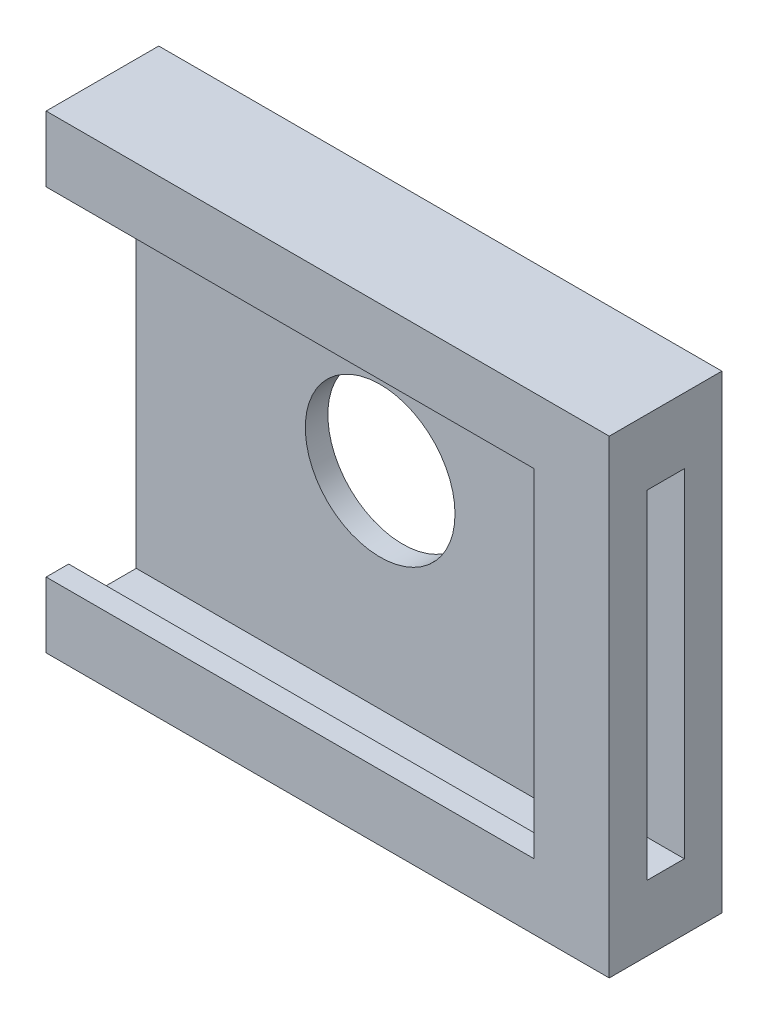
ISO-10303-21;
HEADER;
FILE_DESCRIPTION(('STEP AP214'),'2;1');
FILE_NAME('part.step','',(''),(''),'','','');
FILE_SCHEMA(('AUTOMOTIVE_DESIGN { 1 0 10303 214 1 1 1 1 }'));
ENDSEC;
DATA;
#1=APPLICATION_CONTEXT('core data for automotive mechanical design processes');
#2=APPLICATION_PROTOCOL_DEFINITION('international standard','automotive_design',2000,#1);
#3=PRODUCT_CONTEXT('',#1,'mechanical');
#4=PRODUCT('Part','Part','',(#3));
#5=PRODUCT_RELATED_PRODUCT_CATEGORY('part','',(#4));
#6=PRODUCT_DEFINITION_FORMATION('','',#4);
#7=PRODUCT_DEFINITION_CONTEXT('part definition',#1,'design');
#8=PRODUCT_DEFINITION('design','',#6,#7);
#9=PRODUCT_DEFINITION_SHAPE('','',#8);
#10=(LENGTH_UNIT() NAMED_UNIT(*) SI_UNIT(.MILLI.,.METRE.));
#11=(NAMED_UNIT(*) PLANE_ANGLE_UNIT() SI_UNIT($,.RADIAN.));
#12=(NAMED_UNIT(*) SI_UNIT($,.STERADIAN.) SOLID_ANGLE_UNIT());
#13=UNCERTAINTY_MEASURE_WITH_UNIT(LENGTH_MEASURE(1.E-05),#10,'distance_accuracy_value','');
#14=(GEOMETRIC_REPRESENTATION_CONTEXT(3) GLOBAL_UNCERTAINTY_ASSIGNED_CONTEXT((#13)) GLOBAL_UNIT_ASSIGNED_CONTEXT((#10,
#11,#12)) REPRESENTATION_CONTEXT('',''));
#15=CARTESIAN_POINT('',(0.,0.,0.));
#16=DIRECTION('',(0.,0.,1.));
#17=DIRECTION('',(1.,0.,0.));
#18=AXIS2_PLACEMENT_3D('',#15,#16,#17);
#19=CARTESIAN_POINT('',(0.,0.,3.));
#20=DIRECTION('',(-1.,0.,0.));
#21=DIRECTION('',(0.,0.,1.));
#22=AXIS2_PLACEMENT_3D('',#19,#20,#21);
#23=PLANE('',#22);
#24=DIRECTION('',(0.,0.,-1.));
#25=VECTOR('',#24,1.);
#26=CARTESIAN_POINT('',(0.,10.75,1.));
#27=LINE('',#26,#25);
#28=CARTESIAN_POINT('',(0.,10.75,2.));
#29=VERTEX_POINT('',#28);
#30=CARTESIAN_POINT('',(0.,10.75,1.));
#31=VERTEX_POINT('',#30);
#32=EDGE_CURVE('E169',#29,#31,#27,.T.);
#33=ORIENTED_EDGE('',*,*,#32,.T.);
#34=DIRECTION('',(0.,-1.,0.));
#35=VECTOR('',#34,1.);
#36=CARTESIAN_POINT('',(0.,10.75,1.));
#37=LINE('',#36,#35);
#38=CARTESIAN_POINT('',(0.,1.75,1.));
#39=VERTEX_POINT('',#38);
#40=EDGE_CURVE('E162',#31,#39,#37,.T.);
#41=ORIENTED_EDGE('',*,*,#40,.T.);
#42=DIRECTION('',(0.,0.,1.));
#43=VECTOR('',#42,1.);
#44=CARTESIAN_POINT('',(0.,1.75,1.));
#45=LINE('',#44,#43);
#46=CARTESIAN_POINT('',(0.,1.75,2.));
#47=VERTEX_POINT('',#46);
#48=EDGE_CURVE('E172',#39,#47,#45,.T.);
#49=ORIENTED_EDGE('',*,*,#48,.T.);
#50=DIRECTION('',(0.,1.,0.));
#51=VECTOR('',#50,1.);
#52=CARTESIAN_POINT('',(0.,10.75,2.));
#53=LINE('',#52,#51);
#54=EDGE_CURVE('E62',#47,#29,#53,.T.);
#55=ORIENTED_EDGE('',*,*,#54,.T.);
#56=EDGE_LOOP('',(#33,#41,#49,#55));
#57=FACE_BOUND('',#56,.T.);
#58=DIRECTION('',(0.,1.,0.));
#59=VECTOR('',#58,1.);
#60=CARTESIAN_POINT('',(0.,0.,0.));
#61=LINE('',#60,#59);
#62=CARTESIAN_POINT('',(0.,0.,0.));
#63=VERTEX_POINT('',#62);
#64=CARTESIAN_POINT('',(0.,12.5,0.));
#65=VERTEX_POINT('',#64);
#66=EDGE_CURVE('E288',#63,#65,#61,.T.);
#67=ORIENTED_EDGE('',*,*,#66,.T.);
#68=DIRECTION('',(0.,0.,-1.));
#69=VECTOR('',#68,1.);
#70=CARTESIAN_POINT('',(0.,12.5,3.));
#71=LINE('',#70,#69);
#72=CARTESIAN_POINT('',(0.,12.5,3.));
#73=VERTEX_POINT('',#72);
#74=EDGE_CURVE('E12',#73,#65,#71,.T.);
#75=ORIENTED_EDGE('',*,*,#74,.F.);
#76=DIRECTION('',(0.,1.,0.));
#77=VECTOR('',#76,1.);
#78=CARTESIAN_POINT('',(0.,0.,3.));
#79=LINE('',#78,#77);
#80=CARTESIAN_POINT('',(0.,0.,3.));
#81=VERTEX_POINT('',#80);
#82=EDGE_CURVE('E289',#81,#73,#79,.T.);
#83=ORIENTED_EDGE('',*,*,#82,.F.);
#84=DIRECTION('',(0.,0.,-1.));
#85=VECTOR('',#84,1.);
#86=CARTESIAN_POINT('',(0.,0.,3.));
#87=LINE('',#86,#85);
#88=EDGE_CURVE('E305',#81,#63,#87,.T.);
#89=ORIENTED_EDGE('',*,*,#88,.T.);
#90=EDGE_LOOP('',(#67,#75,#83,#89));
#91=FACE_BOUND('',#90,.T.);
#92=ADVANCED_FACE('F47',(#57,#91),#23,.F.);
#93=CARTESIAN_POINT('',(0.,12.5,3.));
#94=DIRECTION('',(0.,-1.,0.));
#95=DIRECTION('',(1.,0.,0.));
#96=AXIS2_PLACEMENT_3D('',#93,#94,#95);
#97=PLANE('',#96);
#98=DIRECTION('',(-1.,0.,0.));
#99=VECTOR('',#98,1.);
#100=CARTESIAN_POINT('',(0.,12.5,0.));
#101=LINE('',#100,#99);
#102=CARTESIAN_POINT('',(-15.,12.5,0.));
#103=VERTEX_POINT('',#102);
#104=EDGE_CURVE('E309',#65,#103,#101,.T.);
#105=ORIENTED_EDGE('',*,*,#104,.T.);
#106=DIRECTION('',(0.,0.,-1.));
#107=VECTOR('',#106,1.);
#108=CARTESIAN_POINT('',(-15.,12.5,3.));
#109=LINE('',#108,#107);
#110=CARTESIAN_POINT('',(-15.,12.5,3.));
#111=VERTEX_POINT('',#110);
#112=EDGE_CURVE('E55',#111,#103,#109,.T.);
#113=ORIENTED_EDGE('',*,*,#112,.F.);
#114=DIRECTION('',(-1.,0.,0.));
#115=VECTOR('',#114,1.);
#116=CARTESIAN_POINT('',(0.,12.5,3.));
#117=LINE('',#116,#115);
#118=EDGE_CURVE('E293',#73,#111,#117,.T.);
#119=ORIENTED_EDGE('',*,*,#118,.F.);
#120=ORIENTED_EDGE('',*,*,#74,.T.);
#121=EDGE_LOOP('',(#105,#113,#119,#120));
#122=FACE_BOUND('',#121,.T.);
#123=ADVANCED_FACE('F396',(#122),#97,.F.);
#124=CARTESIAN_POINT('',(-15.,0.,3.));
#125=DIRECTION('',(1.,0.,0.));
#126=DIRECTION('',(0.,0.,-1.));
#127=AXIS2_PLACEMENT_3D('',#124,#125,#126);
#128=PLANE('',#127);
#129=DIRECTION('',(0.,1.,0.));
#130=VECTOR('',#129,1.);
#131=CARTESIAN_POINT('',(-15.,11.75,2.4));
#132=LINE('',#131,#130);
#133=CARTESIAN_POINT('',(-15.,10.75,2.4));
#134=VERTEX_POINT('',#133);
#135=CARTESIAN_POINT('',(-15.,11.75,2.4));
#136=VERTEX_POINT('',#135);
#137=EDGE_CURVE('E254',#134,#136,#132,.T.);
#138=ORIENTED_EDGE('',*,*,#137,.F.);
#139=DIRECTION('',(0.,0.,-1.));
#140=VECTOR('',#139,1.);
#141=CARTESIAN_POINT('',(-15.,10.75,2.4));
#142=LINE('',#141,#140);
#143=CARTESIAN_POINT('',(-15.,10.75,3.));
#144=VERTEX_POINT('',#143);
#145=EDGE_CURVE('E250',#144,#134,#142,.T.);
#146=ORIENTED_EDGE('',*,*,#145,.F.);
#147=DIRECTION('',(0.,-1.,0.));
#148=VECTOR('',#147,1.);
#149=CARTESIAN_POINT('',(-15.,0.,3.));
#150=LINE('',#149,#148);
#151=EDGE_CURVE('E298',#111,#144,#150,.T.);
#152=ORIENTED_EDGE('',*,*,#151,.F.);
#153=ORIENTED_EDGE('',*,*,#112,.T.);
#154=DIRECTION('',(0.,-1.,0.));
#155=VECTOR('',#154,1.);
#156=CARTESIAN_POINT('',(-15.,0.,0.));
#157=LINE('',#156,#155);
#158=CARTESIAN_POINT('',(-15.,0.,0.));
#159=VERTEX_POINT('',#158);
#160=EDGE_CURVE('E312',#103,#159,#157,.T.);
#161=ORIENTED_EDGE('',*,*,#160,.T.);
#162=DIRECTION('',(0.,0.,-1.));
#163=VECTOR('',#162,1.);
#164=CARTESIAN_POINT('',(-15.,0.,3.));
#165=LINE('',#164,#163);
#166=CARTESIAN_POINT('',(-15.,0.,3.));
#167=VERTEX_POINT('',#166);
#168=EDGE_CURVE('E320',#167,#159,#165,.T.);
#169=ORIENTED_EDGE('',*,*,#168,.F.);
#170=CARTESIAN_POINT('',(-15.,1.75,3.));
#171=VERTEX_POINT('',#170);
#172=EDGE_CURVE('E297',#171,#167,#150,.T.);
#173=ORIENTED_EDGE('',*,*,#172,.F.);
#174=DIRECTION('',(0.,0.,1.));
#175=VECTOR('',#174,1.);
#176=CARTESIAN_POINT('',(-15.,1.75,2.4));
#177=LINE('',#176,#175);
#178=CARTESIAN_POINT('',(-15.,1.75,2.4));
#179=VERTEX_POINT('',#178);
#180=EDGE_CURVE('E247',#179,#171,#177,.T.);
#181=ORIENTED_EDGE('',*,*,#180,.F.);
#182=DIRECTION('',(0.,1.,0.));
#183=VECTOR('',#182,1.);
#184=CARTESIAN_POINT('',(-15.,1.75,2.4));
#185=LINE('',#184,#183);
#186=CARTESIAN_POINT('',(-15.,0.749999999999999,2.4));
#187=VERTEX_POINT('',#186);
#188=EDGE_CURVE('E243',#187,#179,#185,.T.);
#189=ORIENTED_EDGE('',*,*,#188,.F.);
#190=DIRECTION('',(0.,0.,1.));
#191=VECTOR('',#190,1.);
#192=CARTESIAN_POINT('',(-15.,0.749999999999999,0.6));
#193=LINE('',#192,#191);
#194=CARTESIAN_POINT('',(-15.,0.749999999999999,0.6));
#195=VERTEX_POINT('',#194);
#196=EDGE_CURVE('E239',#195,#187,#193,.T.);
#197=ORIENTED_EDGE('',*,*,#196,.F.);
#198=DIRECTION('',(0.,-1.,0.));
#199=VECTOR('',#198,1.);
#200=CARTESIAN_POINT('',(-15.,11.75,0.6));
#201=LINE('',#200,#199);
#202=CARTESIAN_POINT('',(-15.,11.75,0.6));
#203=VERTEX_POINT('',#202);
#204=EDGE_CURVE('E206',#203,#195,#201,.T.);
#205=ORIENTED_EDGE('',*,*,#204,.F.);
#206=DIRECTION('',(0.,0.,-1.));
#207=VECTOR('',#206,1.);
#208=CARTESIAN_POINT('',(-15.,11.75,0.6));
#209=LINE('',#208,#207);
#210=EDGE_CURVE('E258',#136,#203,#209,.T.);
#211=ORIENTED_EDGE('',*,*,#210,.F.);
#212=EDGE_LOOP('',(#138,#146,#152,#153,#161,#169,#173,#181,#189,#197,#205,#211));
#213=FACE_BOUND('',#212,.T.);
#214=ADVANCED_FACE('F330',(#213),#128,.F.);
#215=CARTESIAN_POINT('',(0.,0.,3.));
#216=DIRECTION('',(0.,1.,0.));
#217=DIRECTION('',(-1.,0.,0.));
#218=AXIS2_PLACEMENT_3D('',#215,#216,#217);
#219=PLANE('',#218);
#220=DIRECTION('',(1.,0.,0.));
#221=VECTOR('',#220,1.);
#222=CARTESIAN_POINT('',(0.,0.,0.));
#223=LINE('',#222,#221);
#224=EDGE_CURVE('E294',#159,#63,#223,.T.);
#225=ORIENTED_EDGE('',*,*,#224,.T.);
#226=ORIENTED_EDGE('',*,*,#88,.F.);
#227=DIRECTION('',(1.,0.,0.));
#228=VECTOR('',#227,1.);
#229=CARTESIAN_POINT('',(0.,0.,3.));
#230=LINE('',#229,#228);
#231=EDGE_CURVE('E302',#167,#81,#230,.T.);
#232=ORIENTED_EDGE('',*,*,#231,.F.);
#233=ORIENTED_EDGE('',*,*,#168,.T.);
#234=EDGE_LOOP('',(#225,#226,#232,#233));
#235=FACE_BOUND('',#234,.T.);
#236=ADVANCED_FACE('F340',(#235),#219,.F.);
#237=CARTESIAN_POINT('',(0.,0.,3.));
#238=DIRECTION('',(0.,0.,1.));
#239=DIRECTION('',(1.,0.,0.));
#240=AXIS2_PLACEMENT_3D('',#237,#238,#239);
#241=PLANE('',#240);
#242=DIRECTION('',(-1.,0.,0.));
#243=VECTOR('',#242,1.);
#244=CARTESIAN_POINT('',(11.2587743560301,10.75,3.));
#245=LINE('',#244,#243);
#246=CARTESIAN_POINT('',(-2.,10.75,3.));
#247=VERTEX_POINT('',#246);
#248=EDGE_CURVE('E271',#247,#144,#245,.T.);
#249=ORIENTED_EDGE('',*,*,#248,.F.);
#250=DIRECTION('',(0.,-1.,0.));
#251=VECTOR('',#250,1.);
#252=CARTESIAN_POINT('',(-2.,1.75,3.));
#253=LINE('',#252,#251);
#254=CARTESIAN_POINT('',(-2.,1.75,3.));
#255=VERTEX_POINT('',#254);
#256=EDGE_CURVE('E219',#247,#255,#253,.T.);
#257=ORIENTED_EDGE('',*,*,#256,.T.);
#258=DIRECTION('',(-1.,0.,0.));
#259=VECTOR('',#258,1.);
#260=CARTESIAN_POINT('',(11.2587743560301,1.75,3.));
#261=LINE('',#260,#259);
#262=EDGE_CURVE('E274',#255,#171,#261,.T.);
#263=ORIENTED_EDGE('',*,*,#262,.T.);
#264=ORIENTED_EDGE('',*,*,#172,.T.);
#265=ORIENTED_EDGE('',*,*,#231,.T.);
#266=ORIENTED_EDGE('',*,*,#82,.T.);
#267=ORIENTED_EDGE('',*,*,#118,.T.);
#268=ORIENTED_EDGE('',*,*,#151,.T.);
#269=EDGE_LOOP('',(#249,#257,#263,#264,#265,#266,#267,#268));
#270=FACE_BOUND('',#269,.T.);
#271=ADVANCED_FACE('F346',(#270),#241,.T.);
#272=CARTESIAN_POINT('',(0.,0.,0.));
#273=DIRECTION('',(0.,0.,1.));
#274=DIRECTION('',(1.,0.,0.));
#275=AXIS2_PLACEMENT_3D('',#272,#273,#274);
#276=PLANE('',#275);
#277=CARTESIAN_POINT('',(-8.50240000000002,6.24999999999998,0.));
#278=DIRECTION('',(0.,0.,1.));
#279=DIRECTION('',(1.,0.,0.));
#280=AXIS2_PLACEMENT_3D('',#277,#278,#279);
#281=CIRCLE('',#280,1.99389999999999);
#282=CARTESIAN_POINT('',(-6.50850000000003,6.24999999999998,0.));
#283=VERTEX_POINT('',#282);
#284=EDGE_CURVE('E197',#283,#283,#281,.T.);
#285=ORIENTED_EDGE('',*,*,#284,.T.);
#286=EDGE_LOOP('',(#285));
#287=FACE_BOUND('',#286,.T.);
#288=ORIENTED_EDGE('',*,*,#66,.F.);
#289=ORIENTED_EDGE('',*,*,#224,.F.);
#290=ORIENTED_EDGE('',*,*,#160,.F.);
#291=ORIENTED_EDGE('',*,*,#104,.F.);
#292=EDGE_LOOP('',(#288,#289,#290,#291));
#293=FACE_BOUND('',#292,.T.);
#294=ADVANCED_FACE('F337',(#287,#293),#276,.F.);
#295=CARTESIAN_POINT('',(11.2587743560301,11.75,0.6));
#296=DIRECTION('',(0.,0.,-1.));
#297=DIRECTION('',(-1.,0.,0.));
#298=AXIS2_PLACEMENT_3D('',#295,#296,#297);
#299=PLANE('',#298);
#300=CARTESIAN_POINT('',(-8.50240000000002,6.24999999999998,0.599999999999934));
#301=DIRECTION('',(0.,0.,1.));
#302=DIRECTION('',(1.,0.,0.));
#303=AXIS2_PLACEMENT_3D('',#300,#301,#302);
#304=CIRCLE('',#303,1.99389999999999);
#305=CARTESIAN_POINT('',(-6.50850000000003,6.24999999999998,0.599999999999934));
#306=VERTEX_POINT('',#305);
#307=EDGE_CURVE('E187',#306,#306,#304,.T.);
#308=ORIENTED_EDGE('',*,*,#307,.F.);
#309=EDGE_LOOP('',(#308));
#310=FACE_BOUND('',#309,.T.);
#311=DIRECTION('',(0.,1.,0.));
#312=VECTOR('',#311,1.);
#313=CARTESIAN_POINT('',(-2.,11.75,0.6));
#314=LINE('',#313,#312);
#315=CARTESIAN_POINT('',(-2.,0.749999999999999,0.6));
#316=VERTEX_POINT('',#315);
#317=CARTESIAN_POINT('',(-2.,11.75,0.6));
#318=VERTEX_POINT('',#317);
#319=EDGE_CURVE('E232',#316,#318,#314,.T.);
#320=ORIENTED_EDGE('',*,*,#319,.T.);
#321=DIRECTION('',(-1.,0.,0.));
#322=VECTOR('',#321,1.);
#323=CARTESIAN_POINT('',(11.2587743560301,11.75,0.6));
#324=LINE('',#323,#322);
#325=EDGE_CURVE('E216',#318,#203,#324,.T.);
#326=ORIENTED_EDGE('',*,*,#325,.T.);
#327=ORIENTED_EDGE('',*,*,#204,.T.);
#328=DIRECTION('',(-1.,0.,0.));
#329=VECTOR('',#328,1.);
#330=CARTESIAN_POINT('',(11.2587743560301,0.749999999999999,0.6));
#331=LINE('',#330,#329);
#332=EDGE_CURVE('E262',#316,#195,#331,.T.);
#333=ORIENTED_EDGE('',*,*,#332,.F.);
#334=EDGE_LOOP('',(#320,#326,#327,#333));
#335=FACE_BOUND('',#334,.T.);
#336=ADVANCED_FACE('F367',(#310,#335),#299,.F.);
#337=CARTESIAN_POINT('',(11.2587743560301,11.75,0.6));
#338=DIRECTION('',(0.,1.,0.));
#339=DIRECTION('',(0.,0.,1.));
#340=AXIS2_PLACEMENT_3D('',#337,#338,#339);
#341=PLANE('',#340);
#342=DIRECTION('',(0.,0.,1.));
#343=VECTOR('',#342,1.);
#344=CARTESIAN_POINT('',(-2.,11.75,0.6));
#345=LINE('',#344,#343);
#346=CARTESIAN_POINT('',(-2.,11.75,2.4));
#347=VERTEX_POINT('',#346);
#348=EDGE_CURVE('E229',#318,#347,#345,.T.);
#349=ORIENTED_EDGE('',*,*,#348,.T.);
#350=DIRECTION('',(-1.,0.,0.));
#351=VECTOR('',#350,1.);
#352=CARTESIAN_POINT('',(11.2587743560301,11.75,2.4));
#353=LINE('',#352,#351);
#354=EDGE_CURVE('E265',#347,#136,#353,.T.);
#355=ORIENTED_EDGE('',*,*,#354,.T.);
#356=ORIENTED_EDGE('',*,*,#210,.T.);
#357=ORIENTED_EDGE('',*,*,#325,.F.);
#358=EDGE_LOOP('',(#349,#355,#356,#357));
#359=FACE_BOUND('',#358,.T.);
#360=ADVANCED_FACE('F372',(#359),#341,.F.);
#361=CARTESIAN_POINT('',(11.2587743560301,11.75,2.4));
#362=DIRECTION('',(0.,0.,1.));
#363=DIRECTION('',(1.,0.,0.));
#364=AXIS2_PLACEMENT_3D('',#361,#362,#363);
#365=PLANE('',#364);
#366=DIRECTION('',(0.,-1.,0.));
#367=VECTOR('',#366,1.);
#368=CARTESIAN_POINT('',(-2.,11.75,2.4));
#369=LINE('',#368,#367);
#370=CARTESIAN_POINT('',(-2.,10.75,2.4));
#371=VERTEX_POINT('',#370);
#372=EDGE_CURVE('E226',#347,#371,#369,.T.);
#373=ORIENTED_EDGE('',*,*,#372,.T.);
#374=DIRECTION('',(-1.,0.,0.));
#375=VECTOR('',#374,1.);
#376=CARTESIAN_POINT('',(11.2587743560301,10.75,2.4));
#377=LINE('',#376,#375);
#378=EDGE_CURVE('E268',#371,#134,#377,.T.);
#379=ORIENTED_EDGE('',*,*,#378,.T.);
#380=ORIENTED_EDGE('',*,*,#137,.T.);
#381=ORIENTED_EDGE('',*,*,#354,.F.);
#382=EDGE_LOOP('',(#373,#379,#380,#381));
#383=FACE_BOUND('',#382,.T.);
#384=ADVANCED_FACE('F376',(#383),#365,.F.);
#385=CARTESIAN_POINT('',(11.2587743560301,10.75,2.4));
#386=DIRECTION('',(0.,1.,0.));
#387=DIRECTION('',(0.,0.,1.));
#388=AXIS2_PLACEMENT_3D('',#385,#386,#387);
#389=PLANE('',#388);
#390=DIRECTION('',(0.,0.,1.));
#391=VECTOR('',#390,1.);
#392=CARTESIAN_POINT('',(-2.,10.75,2.4));
#393=LINE('',#392,#391);
#394=EDGE_CURVE('E223',#371,#247,#393,.T.);
#395=ORIENTED_EDGE('',*,*,#394,.T.);
#396=ORIENTED_EDGE('',*,*,#248,.T.);
#397=ORIENTED_EDGE('',*,*,#145,.T.);
#398=ORIENTED_EDGE('',*,*,#378,.F.);
#399=EDGE_LOOP('',(#395,#396,#397,#398));
#400=FACE_BOUND('',#399,.T.);
#401=ADVANCED_FACE('F380',(#400),#389,.F.);
#402=CARTESIAN_POINT('',(11.2587743560301,1.75,2.4));
#403=DIRECTION('',(0.,-1.,0.));
#404=DIRECTION('',(0.,0.,-1.));
#405=AXIS2_PLACEMENT_3D('',#402,#403,#404);
#406=PLANE('',#405);
#407=DIRECTION('',(0.,0.,-1.));
#408=VECTOR('',#407,1.);
#409=CARTESIAN_POINT('',(-2.,1.75,2.4));
#410=LINE('',#409,#408);
#411=CARTESIAN_POINT('',(-2.,1.75,2.4));
#412=VERTEX_POINT('',#411);
#413=EDGE_CURVE('E215',#255,#412,#410,.T.);
#414=ORIENTED_EDGE('',*,*,#413,.T.);
#415=DIRECTION('',(-1.,0.,0.));
#416=VECTOR('',#415,1.);
#417=CARTESIAN_POINT('',(11.2587743560301,1.75,2.4));
#418=LINE('',#417,#416);
#419=EDGE_CURVE('E278',#412,#179,#418,.T.);
#420=ORIENTED_EDGE('',*,*,#419,.T.);
#421=ORIENTED_EDGE('',*,*,#180,.T.);
#422=ORIENTED_EDGE('',*,*,#262,.F.);
#423=EDGE_LOOP('',(#414,#420,#421,#422));
#424=FACE_BOUND('',#423,.T.);
#425=ADVANCED_FACE('F353',(#424),#406,.F.);
#426=CARTESIAN_POINT('',(11.2587743560301,1.75,2.4));
#427=DIRECTION('',(0.,0.,1.));
#428=DIRECTION('',(1.,0.,0.));
#429=AXIS2_PLACEMENT_3D('',#426,#427,#428);
#430=PLANE('',#429);
#431=DIRECTION('',(0.,-1.,0.));
#432=VECTOR('',#431,1.);
#433=CARTESIAN_POINT('',(-2.,1.75,2.4));
#434=LINE('',#433,#432);
#435=CARTESIAN_POINT('',(-2.,0.749999999999999,2.4));
#436=VERTEX_POINT('',#435);
#437=EDGE_CURVE('E212',#412,#436,#434,.T.);
#438=ORIENTED_EDGE('',*,*,#437,.T.);
#439=DIRECTION('',(-1.,0.,0.));
#440=VECTOR('',#439,1.);
#441=CARTESIAN_POINT('',(11.2587743560301,0.749999999999999,2.4));
#442=LINE('',#441,#440);
#443=EDGE_CURVE('E281',#436,#187,#442,.T.);
#444=ORIENTED_EDGE('',*,*,#443,.T.);
#445=ORIENTED_EDGE('',*,*,#188,.T.);
#446=ORIENTED_EDGE('',*,*,#419,.F.);
#447=EDGE_LOOP('',(#438,#444,#445,#446));
#448=FACE_BOUND('',#447,.T.);
#449=ADVANCED_FACE('F358',(#448),#430,.F.);
#450=CARTESIAN_POINT('',(11.2587743560301,0.749999999999999,0.6));
#451=DIRECTION('',(0.,-1.,0.));
#452=DIRECTION('',(0.,0.,-1.));
#453=AXIS2_PLACEMENT_3D('',#450,#451,#452);
#454=PLANE('',#453);
#455=DIRECTION('',(0.,0.,-1.));
#456=VECTOR('',#455,1.);
#457=CARTESIAN_POINT('',(-2.,0.749999999999999,0.6));
#458=LINE('',#457,#456);
#459=EDGE_CURVE('E235',#436,#316,#458,.T.);
#460=ORIENTED_EDGE('',*,*,#459,.T.);
#461=ORIENTED_EDGE('',*,*,#332,.T.);
#462=ORIENTED_EDGE('',*,*,#196,.T.);
#463=ORIENTED_EDGE('',*,*,#443,.F.);
#464=EDGE_LOOP('',(#460,#461,#462,#463));
#465=FACE_BOUND('',#464,.T.);
#466=ADVANCED_FACE('F362',(#465),#454,.F.);
#467=CARTESIAN_POINT('',(-2.,0.,3.));
#468=DIRECTION('',(-1.,0.,0.));
#469=DIRECTION('',(0.,0.,1.));
#470=AXIS2_PLACEMENT_3D('',#467,#468,#469);
#471=PLANE('',#470);
#472=DIRECTION('',(0.,-1.,0.));
#473=VECTOR('',#472,1.);
#474=CARTESIAN_POINT('',(-2.,10.75,1.));
#475=LINE('',#474,#473);
#476=CARTESIAN_POINT('',(-2.,10.75,1.));
#477=VERTEX_POINT('',#476);
#478=CARTESIAN_POINT('',(-2.,1.75,1.));
#479=VERTEX_POINT('',#478);
#480=EDGE_CURVE('E70',#477,#479,#475,.T.);
#481=ORIENTED_EDGE('',*,*,#480,.F.);
#482=DIRECTION('',(0.,0.,-1.));
#483=VECTOR('',#482,1.);
#484=CARTESIAN_POINT('',(-2.,10.75,1.));
#485=LINE('',#484,#483);
#486=CARTESIAN_POINT('',(-2.,10.75,2.));
#487=VERTEX_POINT('',#486);
#488=EDGE_CURVE('E180',#487,#477,#485,.T.);
#489=ORIENTED_EDGE('',*,*,#488,.F.);
#490=DIRECTION('',(0.,1.,0.));
#491=VECTOR('',#490,1.);
#492=CARTESIAN_POINT('',(-2.,10.75,2.));
#493=LINE('',#492,#491);
#494=CARTESIAN_POINT('',(-2.,1.75,2.));
#495=VERTEX_POINT('',#494);
#496=EDGE_CURVE('E184',#495,#487,#493,.T.);
#497=ORIENTED_EDGE('',*,*,#496,.F.);
#498=DIRECTION('',(0.,0.,1.));
#499=VECTOR('',#498,1.);
#500=CARTESIAN_POINT('',(-2.,1.75,1.));
#501=LINE('',#500,#499);
#502=EDGE_CURVE('E196',#479,#495,#501,.T.);
#503=ORIENTED_EDGE('',*,*,#502,.F.);
#504=EDGE_LOOP('',(#481,#489,#497,#503));
#505=FACE_BOUND('',#504,.T.);
#506=ORIENTED_EDGE('',*,*,#319,.F.);
#507=ORIENTED_EDGE('',*,*,#459,.F.);
#508=ORIENTED_EDGE('',*,*,#437,.F.);
#509=ORIENTED_EDGE('',*,*,#413,.F.);
#510=ORIENTED_EDGE('',*,*,#256,.F.);
#511=ORIENTED_EDGE('',*,*,#394,.F.);
#512=ORIENTED_EDGE('',*,*,#372,.F.);
#513=ORIENTED_EDGE('',*,*,#348,.F.);
#514=EDGE_LOOP('',(#506,#507,#508,#509,#510,#511,#512,#513));
#515=FACE_BOUND('',#514,.T.);
#516=ADVANCED_FACE('F383',(#505,#515),#471,.T.);
#517=CARTESIAN_POINT('',(0.,10.75,1.));
#518=DIRECTION('',(0.,0.,-1.));
#519=DIRECTION('',(-1.,0.,0.));
#520=AXIS2_PLACEMENT_3D('',#517,#518,#519);
#521=PLANE('',#520);
#522=ORIENTED_EDGE('',*,*,#480,.T.);
#523=DIRECTION('',(-1.,0.,0.));
#524=VECTOR('',#523,1.);
#525=CARTESIAN_POINT('',(0.,1.75,1.));
#526=LINE('',#525,#524);
#527=EDGE_CURVE('E158',#39,#479,#526,.T.);
#528=ORIENTED_EDGE('',*,*,#527,.F.);
#529=ORIENTED_EDGE('',*,*,#40,.F.);
#530=DIRECTION('',(-1.,0.,0.));
#531=VECTOR('',#530,1.);
#532=CARTESIAN_POINT('',(0.,10.75,1.));
#533=LINE('',#532,#531);
#534=EDGE_CURVE('E203',#31,#477,#533,.T.);
#535=ORIENTED_EDGE('',*,*,#534,.T.);
#536=EDGE_LOOP('',(#522,#528,#529,#535));
#537=FACE_BOUND('',#536,.T.);
#538=ADVANCED_FACE('F160',(#537),#521,.F.);
#539=CARTESIAN_POINT('',(0.,10.75,1.));
#540=DIRECTION('',(0.,1.,0.));
#541=DIRECTION('',(0.,0.,1.));
#542=AXIS2_PLACEMENT_3D('',#539,#540,#541);
#543=PLANE('',#542);
#544=ORIENTED_EDGE('',*,*,#488,.T.);
#545=ORIENTED_EDGE('',*,*,#534,.F.);
#546=ORIENTED_EDGE('',*,*,#32,.F.);
#547=DIRECTION('',(-1.,0.,0.));
#548=VECTOR('',#547,1.);
#549=CARTESIAN_POINT('',(0.,10.75,2.));
#550=LINE('',#549,#548);
#551=EDGE_CURVE('E207',#29,#487,#550,.T.);
#552=ORIENTED_EDGE('',*,*,#551,.T.);
#553=EDGE_LOOP('',(#544,#545,#546,#552));
#554=FACE_BOUND('',#553,.T.);
#555=ADVANCED_FACE('F391',(#554),#543,.F.);
#556=CARTESIAN_POINT('',(0.,10.75,2.));
#557=DIRECTION('',(0.,0.,1.));
#558=DIRECTION('',(0.,-1.,0.));
#559=AXIS2_PLACEMENT_3D('',#556,#557,#558);
#560=PLANE('',#559);
#561=ORIENTED_EDGE('',*,*,#496,.T.);
#562=ORIENTED_EDGE('',*,*,#551,.F.);
#563=ORIENTED_EDGE('',*,*,#54,.F.);
#564=DIRECTION('',(-1.,0.,0.));
#565=VECTOR('',#564,1.);
#566=CARTESIAN_POINT('',(0.,1.75,2.));
#567=LINE('',#566,#565);
#568=EDGE_CURVE('E168',#47,#495,#567,.T.);
#569=ORIENTED_EDGE('',*,*,#568,.T.);
#570=EDGE_LOOP('',(#561,#562,#563,#569));
#571=FACE_BOUND('',#570,.T.);
#572=ADVANCED_FACE('F473',(#571),#560,.F.);
#573=CARTESIAN_POINT('',(0.,1.75,1.));
#574=DIRECTION('',(0.,-1.,0.));
#575=DIRECTION('',(0.,0.,-1.));
#576=AXIS2_PLACEMENT_3D('',#573,#574,#575);
#577=PLANE('',#576);
#578=ORIENTED_EDGE('',*,*,#502,.T.);
#579=ORIENTED_EDGE('',*,*,#568,.F.);
#580=ORIENTED_EDGE('',*,*,#48,.F.);
#581=ORIENTED_EDGE('',*,*,#527,.T.);
#582=EDGE_LOOP('',(#578,#579,#580,#581));
#583=FACE_BOUND('',#582,.T.);
#584=ADVANCED_FACE('F173',(#583),#577,.F.);
#585=CARTESIAN_POINT('',(-8.50240000000002,6.24999999999998,0.));
#586=DIRECTION('',(0.,0.,1.));
#587=DIRECTION('',(1.,0.,0.));
#588=AXIS2_PLACEMENT_3D('',#585,#586,#587);
#589=CYLINDRICAL_SURFACE('',#588,1.99389999999999);
#590=ORIENTED_EDGE('',*,*,#284,.F.);
#591=EDGE_LOOP('',(#590));
#592=FACE_BOUND('',#591,.T.);
#593=ORIENTED_EDGE('',*,*,#307,.T.);
#594=EDGE_LOOP('',(#593));
#595=FACE_BOUND('',#594,.T.);
#596=ADVANCED_FACE('F491',(#592,#595),#589,.F.);
#597=CLOSED_SHELL('',(#92,#123,#214,#236,#271,#294,#336,#360,#384,#401,#425,#449,#466,#516,#538,
#555,#572,#584,#596));
#598=MANIFOLD_SOLID_BREP('B2',#597);
#599=ADVANCED_BREP_SHAPE_REPRESENTATION('',(#18,#598),#14);
#600=SHAPE_DEFINITION_REPRESENTATION(#9,#599);
ENDSEC;
END-ISO-10303-21;
